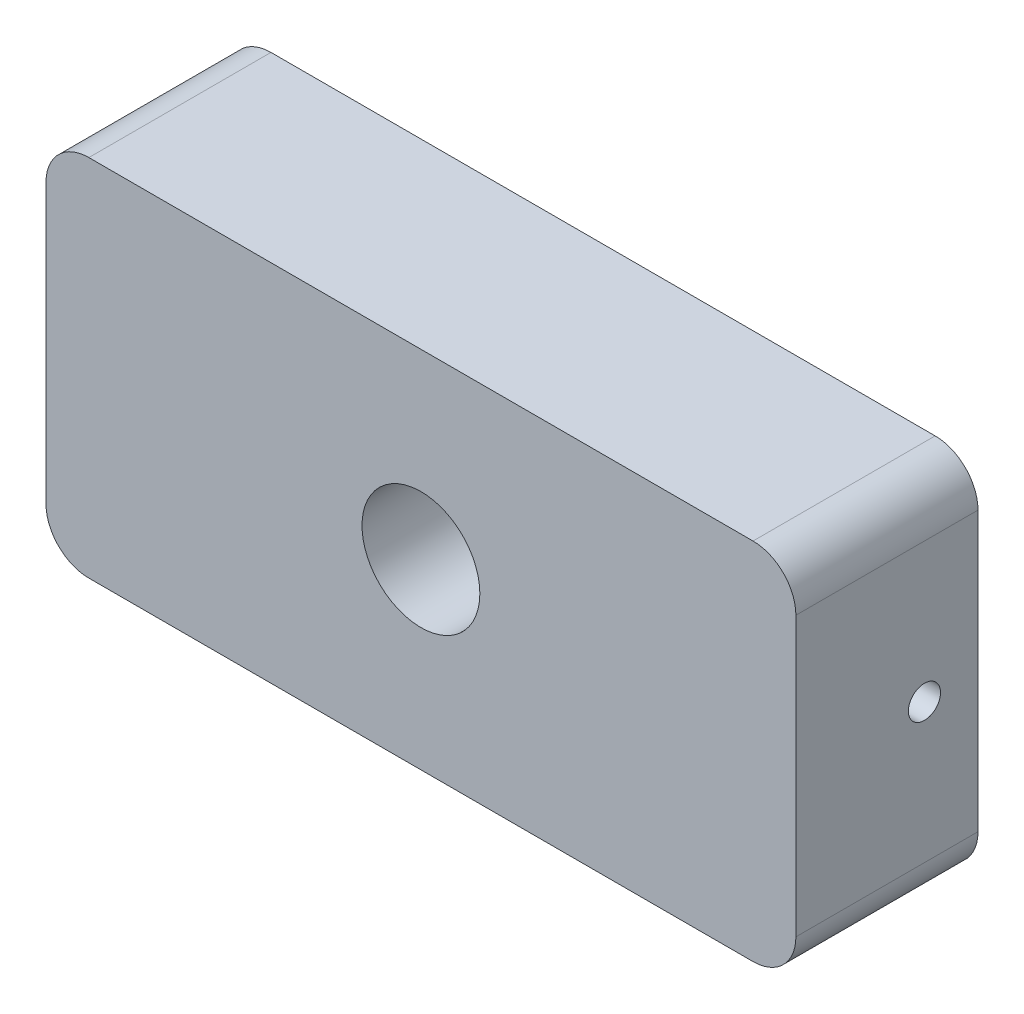
ISO-10303-21;
HEADER;
FILE_DESCRIPTION(('STEP AP214'),'2;1');
FILE_NAME('part.step','',(''),(''),'','','');
FILE_SCHEMA(('AUTOMOTIVE_DESIGN { 1 0 10303 214 1 1 1 1 }'));
ENDSEC;
DATA;
#1=APPLICATION_CONTEXT('core data for automotive mechanical design processes');
#2=APPLICATION_PROTOCOL_DEFINITION('international standard','automotive_design',2000,#1);
#3=PRODUCT_CONTEXT('',#1,'mechanical');
#4=PRODUCT('Part','Part','',(#3));
#5=PRODUCT_RELATED_PRODUCT_CATEGORY('part','',(#4));
#6=PRODUCT_DEFINITION_FORMATION('','',#4);
#7=PRODUCT_DEFINITION_CONTEXT('part definition',#1,'design');
#8=PRODUCT_DEFINITION('design','',#6,#7);
#9=PRODUCT_DEFINITION_SHAPE('','',#8);
#10=(LENGTH_UNIT() NAMED_UNIT(*) SI_UNIT(.MILLI.,.METRE.));
#11=(NAMED_UNIT(*) PLANE_ANGLE_UNIT() SI_UNIT($,.RADIAN.));
#12=(NAMED_UNIT(*) SI_UNIT($,.STERADIAN.) SOLID_ANGLE_UNIT());
#13=UNCERTAINTY_MEASURE_WITH_UNIT(LENGTH_MEASURE(1.E-05),#10,'distance_accuracy_value','');
#14=(GEOMETRIC_REPRESENTATION_CONTEXT(3) GLOBAL_UNCERTAINTY_ASSIGNED_CONTEXT((#13)) GLOBAL_UNIT_ASSIGNED_CONTEXT((#10,
#11,#12)) REPRESENTATION_CONTEXT('',''));
#15=CARTESIAN_POINT('',(0.,0.,0.));
#16=DIRECTION('',(0.,0.,1.));
#17=DIRECTION('',(1.,0.,0.));
#18=AXIS2_PLACEMENT_3D('',#15,#16,#17);
#19=CARTESIAN_POINT('',(0.,0.,0.));
#20=DIRECTION('',(0.,0.,1.));
#21=DIRECTION('',(1.,0.,0.));
#22=AXIS2_PLACEMENT_3D('',#19,#20,#21);
#23=PLANE('',#22);
#24=DIRECTION('',(-1.,0.,0.));
#25=VECTOR('',#24,1.);
#26=CARTESIAN_POINT('',(264.019677402521,55.205269585405,0.));
#27=LINE('',#26,#25);
#28=CARTESIAN_POINT('',(260.019677402521,55.205269585405,0.));
#29=VERTEX_POINT('',#28);
#30=CARTESIAN_POINT('',(198.01967740252,55.205269585405,0.));
#31=VERTEX_POINT('',#30);
#32=EDGE_CURVE('E123',#29,#31,#27,.T.);
#33=ORIENTED_EDGE('',*,*,#32,.F.);
#34=CARTESIAN_POINT('',(260.019677402521,51.205269585405,0.));
#35=DIRECTION('',(0.,0.,1.));
#36=DIRECTION('',(1.,0.,0.));
#37=AXIS2_PLACEMENT_3D('',#34,#35,#36);
#38=CIRCLE('',#37,4.);
#39=CARTESIAN_POINT('',(264.019677402521,51.205269585405,0.));
#40=VERTEX_POINT('',#39);
#41=EDGE_CURVE('E106',#29,#40,#38,.F.);
#42=ORIENTED_EDGE('',*,*,#41,.T.);
#43=DIRECTION('',(0.,1.,0.));
#44=VECTOR('',#43,1.);
#45=CARTESIAN_POINT('',(264.019677402521,21.2052695854051,0.));
#46=LINE('',#45,#44);
#47=CARTESIAN_POINT('',(264.019677402521,25.2052695854051,0.));
#48=VERTEX_POINT('',#47);
#49=EDGE_CURVE('E133',#48,#40,#46,.T.);
#50=ORIENTED_EDGE('',*,*,#49,.F.);
#51=CARTESIAN_POINT('',(260.019677402521,25.2052695854051,0.));
#52=DIRECTION('',(0.,0.,1.));
#53=DIRECTION('',(1.,0.,0.));
#54=AXIS2_PLACEMENT_3D('',#51,#52,#53);
#55=CIRCLE('',#54,4.);
#56=CARTESIAN_POINT('',(260.019677402521,21.2052695854051,0.));
#57=VERTEX_POINT('',#56);
#58=EDGE_CURVE('E117',#48,#57,#55,.F.);
#59=ORIENTED_EDGE('',*,*,#58,.T.);
#60=DIRECTION('',(1.,0.,0.));
#61=VECTOR('',#60,1.);
#62=CARTESIAN_POINT('',(264.019677402521,21.2052695854051,0.));
#63=LINE('',#62,#61);
#64=CARTESIAN_POINT('',(198.01967740252,21.2052695854051,0.));
#65=VERTEX_POINT('',#64);
#66=EDGE_CURVE('E136',#65,#57,#63,.T.);
#67=ORIENTED_EDGE('',*,*,#66,.F.);
#68=CARTESIAN_POINT('',(198.01967740252,25.2052695854051,0.));
#69=DIRECTION('',(0.,0.,1.));
#70=DIRECTION('',(1.,0.,0.));
#71=AXIS2_PLACEMENT_3D('',#68,#69,#70);
#72=CIRCLE('',#71,4.);
#73=CARTESIAN_POINT('',(194.01967740252,25.2052695854051,0.));
#74=VERTEX_POINT('',#73);
#75=EDGE_CURVE('E127',#65,#74,#72,.F.);
#76=ORIENTED_EDGE('',*,*,#75,.T.);
#77=DIRECTION('',(0.,-1.,0.));
#78=VECTOR('',#77,1.);
#79=CARTESIAN_POINT('',(194.01967740252,21.2052695854051,0.));
#80=LINE('',#79,#78);
#81=CARTESIAN_POINT('',(194.01967740252,51.205269585405,0.));
#82=VERTEX_POINT('',#81);
#83=EDGE_CURVE('E163',#82,#74,#80,.T.);
#84=ORIENTED_EDGE('',*,*,#83,.F.);
#85=CARTESIAN_POINT('',(198.01967740252,51.205269585405,0.));
#86=DIRECTION('',(0.,0.,1.));
#87=DIRECTION('',(1.,0.,0.));
#88=AXIS2_PLACEMENT_3D('',#85,#86,#87);
#89=CIRCLE('',#88,4.);
#90=EDGE_CURVE('E132',#82,#31,#89,.F.);
#91=ORIENTED_EDGE('',*,*,#90,.T.);
#92=EDGE_LOOP('',(#33,#42,#50,#59,#67,#76,#84,#91));
#93=FACE_BOUND('',#92,.T.);
#94=CARTESIAN_POINT('',(229.019677402521,38.205269585405,0.));
#95=DIRECTION('',(0.,0.,1.));
#96=DIRECTION('',(1.,0.,0.));
#97=AXIS2_PLACEMENT_3D('',#94,#95,#96);
#98=CIRCLE('',#97,11.2);
#99=CARTESIAN_POINT('',(240.21967740252,38.205269585405,0.));
#100=VERTEX_POINT('',#99);
#101=EDGE_CURVE('E174',#100,#100,#98,.T.);
#102=ORIENTED_EDGE('',*,*,#101,.T.);
#103=EDGE_LOOP('',(#102));
#104=FACE_BOUND('',#103,.T.);
#105=CARTESIAN_POINT('',(201.31967740252,38.205269585405,0.));
#106=DIRECTION('',(0.,0.,1.));
#107=DIRECTION('',(1.,0.,0.));
#108=AXIS2_PLACEMENT_3D('',#105,#106,#107);
#109=CIRCLE('',#108,4.09999999999999);
#110=CARTESIAN_POINT('',(205.41967740252,38.205269585405,0.));
#111=VERTEX_POINT('',#110);
#112=EDGE_CURVE('E179',#111,#111,#109,.T.);
#113=ORIENTED_EDGE('',*,*,#112,.T.);
#114=EDGE_LOOP('',(#113));
#115=FACE_BOUND('',#114,.T.);
#116=CARTESIAN_POINT('',(256.719677402521,38.205269585405,0.));
#117=DIRECTION('',(0.,0.,1.));
#118=DIRECTION('',(-1.,0.,0.));
#119=AXIS2_PLACEMENT_3D('',#116,#117,#118);
#120=CIRCLE('',#119,4.09999999999999);
#121=CARTESIAN_POINT('',(252.61967740252,38.205269585405,0.));
#122=VERTEX_POINT('',#121);
#123=EDGE_CURVE('E187',#122,#122,#120,.T.);
#124=ORIENTED_EDGE('',*,*,#123,.T.);
#125=EDGE_LOOP('',(#124));
#126=FACE_BOUND('',#125,.T.);
#127=ADVANCED_FACE('F39',(#93,#104,#115,#126),#23,.F.);
#128=CARTESIAN_POINT('',(194.01967740252,21.2052695854051,9.));
#129=DIRECTION('',(1.,0.,0.));
#130=DIRECTION('',(0.,0.,-1.));
#131=AXIS2_PLACEMENT_3D('',#128,#129,#130);
#132=PLANE('',#131);
#133=CARTESIAN_POINT('',(194.01967740252,37.9819697808812,5.));
#134=DIRECTION('',(-1.,0.,0.));
#135=DIRECTION('',(0.,0.,1.));
#136=AXIS2_PLACEMENT_3D('',#133,#134,#135);
#137=CIRCLE('',#136,1.5);
#138=CARTESIAN_POINT('',(194.01967740252,37.9819697808812,6.5));
#139=VERTEX_POINT('',#138);
#140=EDGE_CURVE('E202',#139,#139,#137,.T.);
#141=ORIENTED_EDGE('',*,*,#140,.F.);
#142=EDGE_LOOP('',(#141));
#143=FACE_BOUND('',#142,.T.);
#144=DIRECTION('',(0.,-1.,0.));
#145=VECTOR('',#144,1.);
#146=CARTESIAN_POINT('',(194.01967740252,21.2052695854051,17.));
#147=LINE('',#146,#145);
#148=CARTESIAN_POINT('',(194.01967740252,51.205269585405,17.));
#149=VERTEX_POINT('',#148);
#150=CARTESIAN_POINT('',(194.01967740252,25.2052695854051,17.));
#151=VERTEX_POINT('',#150);
#152=EDGE_CURVE('E161',#149,#151,#147,.T.);
#153=ORIENTED_EDGE('',*,*,#152,.F.);
#154=DIRECTION('',(0.,0.,-1.));
#155=VECTOR('',#154,1.);
#156=CARTESIAN_POINT('',(194.01967740252,51.205269585405,9.));
#157=LINE('',#156,#155);
#158=EDGE_CURVE('E11',#149,#82,#157,.T.);
#159=ORIENTED_EDGE('',*,*,#158,.T.);
#160=ORIENTED_EDGE('',*,*,#83,.T.);
#161=DIRECTION('',(0.,0.,-1.));
#162=VECTOR('',#161,1.);
#163=CARTESIAN_POINT('',(194.01967740252,25.2052695854051,9.));
#164=LINE('',#163,#162);
#165=EDGE_CURVE('E47',#74,#151,#164,.F.);
#166=ORIENTED_EDGE('',*,*,#165,.T.);
#167=EDGE_LOOP('',(#153,#159,#160,#166));
#168=FACE_BOUND('',#167,.T.);
#169=ADVANCED_FACE('F160',(#143,#168),#132,.F.);
#170=CARTESIAN_POINT('',(264.019677402521,21.2052695854051,9.));
#171=DIRECTION('',(0.,1.,0.));
#172=DIRECTION('',(0.,0.,1.));
#173=AXIS2_PLACEMENT_3D('',#170,#171,#172);
#174=PLANE('',#173);
#175=ORIENTED_EDGE('',*,*,#66,.T.);
#176=DIRECTION('',(0.,0.,-1.));
#177=VECTOR('',#176,1.);
#178=CARTESIAN_POINT('',(260.019677402521,21.2052695854051,9.));
#179=LINE('',#178,#177);
#180=CARTESIAN_POINT('',(260.019677402521,21.2052695854051,17.));
#181=VERTEX_POINT('',#180);
#182=EDGE_CURVE('E54',#57,#181,#179,.F.);
#183=ORIENTED_EDGE('',*,*,#182,.T.);
#184=DIRECTION('',(1.,0.,0.));
#185=VECTOR('',#184,1.);
#186=CARTESIAN_POINT('',(194.01967740252,21.2052695854051,17.));
#187=LINE('',#186,#185);
#188=CARTESIAN_POINT('',(198.01967740252,21.2052695854051,17.));
#189=VERTEX_POINT('',#188);
#190=EDGE_CURVE('E169',#189,#181,#187,.T.);
#191=ORIENTED_EDGE('',*,*,#190,.F.);
#192=DIRECTION('',(0.,0.,-1.));
#193=VECTOR('',#192,1.);
#194=CARTESIAN_POINT('',(198.01967740252,21.2052695854051,9.));
#195=LINE('',#194,#193);
#196=EDGE_CURVE('E153',#189,#65,#195,.T.);
#197=ORIENTED_EDGE('',*,*,#196,.T.);
#198=EDGE_LOOP('',(#175,#183,#191,#197));
#199=FACE_BOUND('',#198,.T.);
#200=ADVANCED_FACE('F173',(#199),#174,.F.);
#201=CARTESIAN_POINT('',(264.019677402521,21.2052695854051,9.));
#202=DIRECTION('',(-1.,0.,0.));
#203=DIRECTION('',(0.,0.,1.));
#204=AXIS2_PLACEMENT_3D('',#201,#202,#203);
#205=PLANE('',#204);
#206=CARTESIAN_POINT('',(264.019677402521,38.205269585405,5.));
#207=DIRECTION('',(1.,0.,0.));
#208=DIRECTION('',(0.,0.,-1.));
#209=AXIS2_PLACEMENT_3D('',#206,#207,#208);
#210=CIRCLE('',#209,1.5);
#211=CARTESIAN_POINT('',(264.019677402521,38.205269585405,3.5));
#212=VERTEX_POINT('',#211);
#213=EDGE_CURVE('E213',#212,#212,#210,.T.);
#214=ORIENTED_EDGE('',*,*,#213,.F.);
#215=EDGE_LOOP('',(#214));
#216=FACE_BOUND('',#215,.T.);
#217=ORIENTED_EDGE('',*,*,#49,.T.);
#218=DIRECTION('',(0.,0.,-1.));
#219=VECTOR('',#218,1.);
#220=CARTESIAN_POINT('',(264.019677402521,51.205269585405,9.));
#221=LINE('',#220,#219);
#222=CARTESIAN_POINT('',(264.019677402521,51.205269585405,17.));
#223=VERTEX_POINT('',#222);
#224=EDGE_CURVE('E111',#40,#223,#221,.F.);
#225=ORIENTED_EDGE('',*,*,#224,.T.);
#226=DIRECTION('',(0.,1.,0.));
#227=VECTOR('',#226,1.);
#228=CARTESIAN_POINT('',(264.019677402521,21.2052695854051,17.));
#229=LINE('',#228,#227);
#230=CARTESIAN_POINT('',(264.019677402521,25.2052695854051,17.));
#231=VERTEX_POINT('',#230);
#232=EDGE_CURVE('E196',#231,#223,#229,.T.);
#233=ORIENTED_EDGE('',*,*,#232,.F.);
#234=DIRECTION('',(0.,0.,-1.));
#235=VECTOR('',#234,1.);
#236=CARTESIAN_POINT('',(264.019677402521,25.2052695854051,9.));
#237=LINE('',#236,#235);
#238=EDGE_CURVE('E116',#231,#48,#237,.T.);
#239=ORIENTED_EDGE('',*,*,#238,.T.);
#240=EDGE_LOOP('',(#217,#225,#233,#239));
#241=FACE_BOUND('',#240,.T.);
#242=ADVANCED_FACE('F236',(#216,#241),#205,.F.);
#243=CARTESIAN_POINT('',(264.019677402521,55.205269585405,9.));
#244=DIRECTION('',(0.,-1.,0.));
#245=DIRECTION('',(0.,0.,-1.));
#246=AXIS2_PLACEMENT_3D('',#243,#244,#245);
#247=PLANE('',#246);
#248=DIRECTION('',(-1.,0.,0.));
#249=VECTOR('',#248,1.);
#250=CARTESIAN_POINT('',(194.01967740252,55.205269585405,17.));
#251=LINE('',#250,#249);
#252=CARTESIAN_POINT('',(260.019677402521,55.205269585405,17.));
#253=VERTEX_POINT('',#252);
#254=CARTESIAN_POINT('',(198.01967740252,55.205269585405,17.));
#255=VERTEX_POINT('',#254);
#256=EDGE_CURVE('E126',#253,#255,#251,.T.);
#257=ORIENTED_EDGE('',*,*,#256,.F.);
#258=DIRECTION('',(0.,0.,-1.));
#259=VECTOR('',#258,1.);
#260=CARTESIAN_POINT('',(260.019677402521,55.205269585405,9.));
#261=LINE('',#260,#259);
#262=EDGE_CURVE('E110',#253,#29,#261,.T.);
#263=ORIENTED_EDGE('',*,*,#262,.T.);
#264=ORIENTED_EDGE('',*,*,#32,.T.);
#265=DIRECTION('',(0.,0.,-1.));
#266=VECTOR('',#265,1.);
#267=CARTESIAN_POINT('',(198.01967740252,55.205269585405,9.));
#268=LINE('',#267,#266);
#269=EDGE_CURVE('E128',#31,#255,#268,.F.);
#270=ORIENTED_EDGE('',*,*,#269,.T.);
#271=EDGE_LOOP('',(#257,#263,#264,#270));
#272=FACE_BOUND('',#271,.T.);
#273=ADVANCED_FACE('F122',(#272),#247,.F.);
#274=CARTESIAN_POINT('',(229.019677402521,38.205269585405,9.));
#275=DIRECTION('',(0.,0.,-1.));
#276=DIRECTION('',(-1.,0.,0.));
#277=AXIS2_PLACEMENT_3D('',#274,#275,#276);
#278=CYLINDRICAL_SURFACE('',#277,11.2);
#279=CARTESIAN_POINT('',(229.019677402521,38.205269585405,9.));
#280=DIRECTION('',(0.,0.,1.));
#281=DIRECTION('',(1.,0.,0.));
#282=AXIS2_PLACEMENT_3D('',#279,#280,#281);
#283=CIRCLE('',#282,11.2);
#284=CARTESIAN_POINT('',(240.21967740252,38.205269585405,9.));
#285=VERTEX_POINT('',#284);
#286=EDGE_CURVE('E180',#285,#285,#283,.T.);
#287=ORIENTED_EDGE('',*,*,#286,.T.);
#288=EDGE_LOOP('',(#287));
#289=FACE_BOUND('',#288,.T.);
#290=ORIENTED_EDGE('',*,*,#101,.F.);
#291=EDGE_LOOP('',(#290));
#292=FACE_BOUND('',#291,.T.);
#293=ADVANCED_FACE('F262',(#289,#292),#278,.F.);
#294=CARTESIAN_POINT('',(201.31967740252,38.205269585405,9.));
#295=DIRECTION('',(0.,0.,-1.));
#296=DIRECTION('',(-1.,0.,0.));
#297=AXIS2_PLACEMENT_3D('',#294,#295,#296);
#298=CYLINDRICAL_SURFACE('',#297,4.09999999999999);
#299=CARTESIAN_POINT('',(197.225762748146,37.9819697808812,6.5));
#300=CARTESIAN_POINT('',(197.221367614793,38.0625012179052,6.50000328836046));
#301=CARTESIAN_POINT('',(197.219375107897,38.1431426347727,6.49349539894408));
#302=CARTESIAN_POINT('',(197.220053966743,38.3022966627444,6.46761216524692));
#303=CARTESIAN_POINT('',(197.222724138734,38.3808098135071,6.4482401152715));
#304=CARTESIAN_POINT('',(197.2321123036,38.5333752234645,6.39728857691316));
#305=CARTESIAN_POINT('',(197.238824934372,38.6074332492639,6.36572527941889));
#306=CARTESIAN_POINT('',(197.255303751809,38.7493043563949,6.29136215059782));
#307=CARTESIAN_POINT('',(197.265070738513,38.8171157955026,6.24855937574299));
#308=CARTESIAN_POINT('',(197.286722111127,38.9466954188623,6.15153794329933));
#309=CARTESIAN_POINT('',(197.29865849473,39.008238915807,6.09703108520962));
#310=CARTESIAN_POINT('',(197.322963673394,39.1215917853131,5.97876167270551));
#311=CARTESIAN_POINT('',(197.335332573481,39.1733987738196,5.91499685817042));
#312=CARTESIAN_POINT('',(197.359438501729,39.2678036544016,5.77709609144266));
#313=CARTESIAN_POINT('',(197.371132489368,39.3099670455203,5.70265406322479));
#314=CARTESIAN_POINT('',(197.391737894675,39.3811407319749,5.54736734648543));
#315=CARTESIAN_POINT('',(197.400649884609,39.4101537329411,5.46652397903359));
#316=CARTESIAN_POINT('',(197.414255526436,39.4535449676948,5.30250160272966));
#317=CARTESIAN_POINT('',(197.419034976636,39.4682217276506,5.21940900729525));
#318=CARTESIAN_POINT('',(197.423991528752,39.4834323640842,5.05181394508825));
#319=CARTESIAN_POINT('',(197.424169988561,39.483970413323,4.96731190165369));
#320=CARTESIAN_POINT('',(197.419994752806,39.471173345526,4.80310199727771));
#321=CARTESIAN_POINT('',(197.415832545783,39.4584243997324,4.72334259203993));
#322=CARTESIAN_POINT('',(197.403834300367,39.4204097781957,4.56715802309095));
#323=CARTESIAN_POINT('',(197.395997837166,39.3951426551187,4.49073324603671));
#324=CARTESIAN_POINT('',(197.377544472635,39.3325054456182,4.34225511920492));
#325=CARTESIAN_POINT('',(197.366894163897,39.2949885688129,4.27026805337565));
#326=CARTESIAN_POINT('',(197.344186264891,39.2089844826731,4.13341434883987));
#327=CARTESIAN_POINT('',(197.332128288525,39.160494260115,4.06854967318442));
#328=CARTESIAN_POINT('',(197.307503109239,39.0512753360027,3.94467567461708));
#329=CARTESIAN_POINT('',(197.294937757139,38.990089405965,3.88606820640376));
#330=CARTESIAN_POINT('',(197.271503552824,38.8585275447437,3.77983857789863));
#331=CARTESIAN_POINT('',(197.260634735642,38.7881514238383,3.73221664444795));
#332=CARTESIAN_POINT('',(197.242106762837,38.6399946916634,3.6493679632384));
#333=CARTESIAN_POINT('',(197.234449009754,38.5622108629913,3.61414663293722));
#334=CARTESIAN_POINT('',(197.223587133071,38.4015235358884,3.55735371374695));
#335=CARTESIAN_POINT('',(197.220381244493,38.3186220800048,3.53577671730086));
#336=CARTESIAN_POINT('',(197.219210506772,38.1543829795009,3.5077272171885));
#337=CARTESIAN_POINT('',(197.221000655764,38.073162340059,3.50057724967595));
#338=CARTESIAN_POINT('',(197.229452248719,37.9108962759449,3.49949021374117));
#339=CARTESIAN_POINT('',(197.236113139703,37.8298508324301,3.50555164557817));
#340=CARTESIAN_POINT('',(197.253746533803,37.6719905395978,3.53025065056443));
#341=CARTESIAN_POINT('',(197.264624624477,37.5951224245709,3.54861885009072));
#342=CARTESIAN_POINT('',(197.289930708365,37.4457388655082,3.59692384495232));
#343=CARTESIAN_POINT('',(197.304359364383,37.3732242373085,3.62686280085805));
#344=CARTESIAN_POINT('',(197.336386364316,37.2311414678353,3.69889517187315));
#345=CARTESIAN_POINT('',(197.354094960589,37.1618371404738,3.74145902676741));
#346=CARTESIAN_POINT('',(197.390792017068,37.0311859133505,3.83700123033098));
#347=CARTESIAN_POINT('',(197.409781026639,36.9698424626571,3.88998406820988));
#348=CARTESIAN_POINT('',(197.44858602259,36.8529867652243,4.00866634855774));
#349=CARTESIAN_POINT('',(197.468382821481,36.7980492667385,4.07493998842688));
#350=CARTESIAN_POINT('',(197.505616020776,36.7000479791529,4.2163699655763));
#351=CARTESIAN_POINT('',(197.523052381292,36.6569843906962,4.29152645292656));
#352=CARTESIAN_POINT('',(197.553415694641,36.5845258608737,4.44816430220671));
#353=CARTESIAN_POINT('',(197.566383291508,36.5550068657785,4.52957994621173));
#354=CARTESIAN_POINT('',(197.586329802561,36.5103572920452,4.69694694461265));
#355=CARTESIAN_POINT('',(197.593313709825,36.4952147158925,4.78289445369761));
#356=CARTESIAN_POINT('',(197.600005800319,36.4807124477461,4.94908599316728));
#357=CARTESIAN_POINT('',(197.60027589841,36.4801337690108,5.02920262362345));
#358=CARTESIAN_POINT('',(197.594932724905,36.491701049112,5.18830416585669));
#359=CARTESIAN_POINT('',(197.589319975894,36.5038458776896,5.26728917752633));
#360=CARTESIAN_POINT('',(197.573198316194,36.539659445196,5.41905716713205));
#361=CARTESIAN_POINT('',(197.562869837713,36.5629048442061,5.49196072476266));
#362=CARTESIAN_POINT('',(197.538470277004,36.6198898311815,5.63286509426257));
#363=CARTESIAN_POINT('',(197.524398182549,36.653632257836,5.70086457379761));
#364=CARTESIAN_POINT('',(197.492812779153,36.7331791062357,5.83485500562564));
#365=CARTESIAN_POINT('',(197.475134648866,36.7796278433961,5.90042406525771));
#366=CARTESIAN_POINT('',(197.438646067187,36.8821834408752,6.02316773082357));
#367=CARTESIAN_POINT('',(197.419835172341,36.9382940998332,6.0803390186816));
#368=CARTESIAN_POINT('',(197.381305209207,37.0634248525468,6.18896131765127));
#369=CARTESIAN_POINT('',(197.361620749323,37.1330900062561,6.23968502933488));
#370=CARTESIAN_POINT('',(197.324595317932,37.2805555226822,6.32869742117978));
#371=CARTESIAN_POINT('',(197.307254886929,37.3583577543954,6.36698323616553));
#372=CARTESIAN_POINT('',(197.27559136985,37.5248662872464,6.43160192959869));
#373=CARTESIAN_POINT('',(197.261504748902,37.6139444332658,6.45710256073565));
#374=CARTESIAN_POINT('',(197.239132364174,37.7959577592014,6.49129405648455));
#375=CARTESIAN_POINT('',(197.230842710813,37.8888903085011,6.49999619926245));
#376=CARTESIAN_POINT('',(197.225762748146,37.9819697808812,6.5));
#377=B_SPLINE_CURVE_WITH_KNOTS('',3,(#299,#300,#301,#302,#303,#304,#305,#306,#307,#308,#309,
#310,#311,#312,#313,#314,#315,#316,#317,#318,#319,#320,#321,#322,#323,#324,#325,#326,#327,#328,
#329,#330,#331,#332,#333,#334,#335,#336,#337,#338,#339,#340,#341,#342,#343,#344,#345,#346,#347,
#348,#349,#350,#351,#352,#353,#354,#355,#356,#357,#358,#359,#360,#361,#362,#363,#364,#365,#366,
#367,#368,#369,#370,#371,#372,#373,#374,#375,#376),.UNSPECIFIED.,.T.,.F.,(4,2,2,2,2,2,2,2,2,2,2,
2,2,2,2,2,2,2,2,2,2,2,2,2,2,2,2,2,2,2,2,2,2,2,2,2,2,2,4),(0.,0.241619957729488,0.48317806430891,
0.724416460639063,0.965718098470502,1.21383278281615,1.46200814091731,1.71979761110279,
1.97753401822736,2.22978124511476,2.4819540253826,2.72345444358418,2.96498279023832,
3.20951869013188,3.45412181996528,3.70987830394776,3.96564006859273,4.22151342976601,
4.47728531889808,4.72073772489252,4.96416249592787,5.20242599456102,5.44073400488927,
5.68936782963744,5.93810901847851,6.20185073648289,6.46559691087037,6.7268767180445,
6.98793828791348,7.22706929590364,7.46617906313146,7.69682098347663,7.92752533013049,
8.17331118718421,8.41919389790175,8.68311424709649,8.94709534955519,9.22655109578561,
9.50581915572639),.UNSPECIFIED.);
#378=CARTESIAN_POINT('',(197.225762748146,37.9819697808812,6.5));
#379=VERTEX_POINT('',#378);
#380=EDGE_CURVE('E205',#379,#379,#377,.T.);
#381=ORIENTED_EDGE('',*,*,#380,.T.);
#382=EDGE_LOOP('',(#381));
#383=FACE_BOUND('',#382,.T.);
#384=CARTESIAN_POINT('',(201.31967740252,38.205269585405,9.));
#385=DIRECTION('',(0.,0.,1.));
#386=DIRECTION('',(1.,0.,0.));
#387=AXIS2_PLACEMENT_3D('',#384,#385,#386);
#388=CIRCLE('',#387,4.09999999999999);
#389=CARTESIAN_POINT('',(205.41967740252,38.205269585405,9.));
#390=VERTEX_POINT('',#389);
#391=EDGE_CURVE('E183',#390,#390,#388,.T.);
#392=ORIENTED_EDGE('',*,*,#391,.T.);
#393=EDGE_LOOP('',(#392));
#394=FACE_BOUND('',#393,.T.);
#395=ORIENTED_EDGE('',*,*,#112,.F.);
#396=EDGE_LOOP('',(#395));
#397=FACE_BOUND('',#396,.T.);
#398=ADVANCED_FACE('F324',(#383,#394,#397),#298,.F.);
#399=CARTESIAN_POINT('',(256.719677402521,38.205269585405,9.));
#400=DIRECTION('',(0.,0.,-1.));
#401=DIRECTION('',(-1.,0.,0.));
#402=AXIS2_PLACEMENT_3D('',#399,#400,#401);
#403=CYLINDRICAL_SURFACE('',#402,4.09999999999999);
#404=CARTESIAN_POINT('',(260.81967740252,38.205269585405,3.5));
#405=CARTESIAN_POINT('',(260.819679061754,38.2866436840973,3.49999774239284));
#406=CARTESIAN_POINT('',(260.817233434404,38.3680019667986,3.50664266171369));
#407=CARTESIAN_POINT('',(260.807720892994,38.5282948185775,3.53294528247945));
#408=CARTESIAN_POINT('',(260.800654394879,38.6072296051351,3.55260181269478));
#409=CARTESIAN_POINT('',(260.782660791034,38.7603410732945,3.60414464565237));
#410=CARTESIAN_POINT('',(260.771740913055,38.8345263578143,3.63600806156215));
#411=CARTESIAN_POINT('',(260.747134232948,38.9764952528343,3.71094671874485));
#412=CARTESIAN_POINT('',(260.733446728392,39.0442772317444,3.75402480711967));
#413=CARTESIAN_POINT('',(260.704101203919,39.1742754144951,3.85200445435231));
#414=CARTESIAN_POINT('',(260.688389295309,39.2361959902935,3.90728197001066));
#415=CARTESIAN_POINT('',(260.657037869439,39.3501234652035,4.02729309688534));
#416=CARTESIAN_POINT('',(260.641398374051,39.402127538473,4.0920293942555));
#417=CARTESIAN_POINT('',(260.611343512913,39.4965807970649,4.23195663606843));
#418=CARTESIAN_POINT('',(260.596992228645,39.538620058078,4.30743941731413));
#419=CARTESIAN_POINT('',(260.57197283945,39.6092764482369,4.46501228503891));
#420=CARTESIAN_POINT('',(260.561303344357,39.6378986448511,4.54709986321641));
#421=CARTESIAN_POINT('',(260.545429702662,39.6797544345267,4.71215690285583));
#422=CARTESIAN_POINT('',(260.540026718103,39.6935500943969,4.79496408352549));
#423=CARTESIAN_POINT('',(260.534714417968,39.7071187678802,4.96188075448901));
#424=CARTESIAN_POINT('',(260.534802971677,39.7068972201679,5.04598972702406));
#425=CARTESIAN_POINT('',(260.5402916516,39.6928690398242,5.20806364187105));
#426=CARTESIAN_POINT('',(260.545391265127,39.6798309943722,5.28610714531584));
#427=CARTESIAN_POINT('',(260.559829800043,39.6418066799204,5.43881043874728));
#428=CARTESIAN_POINT('',(260.569169328778,39.6168186991282,5.51346974227949));
#429=CARTESIAN_POINT('',(260.591223672069,39.5551638073965,5.65889233907603));
#430=CARTESIAN_POINT('',(260.603997219665,39.5182912101573,5.72955912934113));
#431=CARTESIAN_POINT('',(260.631459633012,39.4340569346625,5.86392985479533));
#432=CARTESIAN_POINT('',(260.646149136369,39.3866917609347,5.92763145903135));
#433=CARTESIAN_POINT('',(260.676930808712,39.2792606822224,6.05053337974803));
#434=CARTESIAN_POINT('',(260.693052711168,39.2185777792476,6.1091881901549));
#435=CARTESIAN_POINT('',(260.724074750718,39.0880477383012,6.21564654931691));
#436=CARTESIAN_POINT('',(260.738974717519,39.0181993265137,6.26344858723549));
#437=CARTESIAN_POINT('',(260.766145376215,38.8699836395572,6.34740761756008));
#438=CARTESIAN_POINT('',(260.778376081048,38.7915102380422,6.38339111572899));
#439=CARTESIAN_POINT('',(260.79853520945,38.6290657932768,6.44146738458586));
#440=CARTESIAN_POINT('',(260.806465447802,38.5450970858186,6.46356601526801));
#441=CARTESIAN_POINT('',(260.816815289096,38.3786429102147,6.49221548147773));
#442=CARTESIAN_POINT('',(260.819495191372,38.2963000240324,6.49950144656874));
#443=CARTESIAN_POINT('',(260.819841373979,38.1315345965993,6.50044869781518));
#444=CARTESIAN_POINT('',(260.817508702873,38.0491120756122,6.49411283347612));
#445=CARTESIAN_POINT('',(260.808263773197,37.8896499033289,6.4685607588009));
#446=CARTESIAN_POINT('',(260.801520362706,37.8125234031727,6.44981914837904));
#447=CARTESIAN_POINT('',(260.784301108989,37.6625582052641,6.40060523225225));
#448=CARTESIAN_POINT('',(260.773824780177,37.589720066786,6.3701314003584));
#449=CARTESIAN_POINT('',(260.74980554702,37.4480504855193,6.29736021448218));
#450=CARTESIAN_POINT('',(260.736182986941,37.379394943167,6.25474750546132));
#451=CARTESIAN_POINT('',(260.707387497237,37.2499841092975,6.1592675392469));
#452=CARTESIAN_POINT('',(260.692214016435,37.1892316439885,6.1063966303809));
#453=CARTESIAN_POINT('',(260.660953807017,37.0738499266052,5.98846500373468));
#454=CARTESIAN_POINT('',(260.644862873023,37.0197433142404,5.92289274450286));
#455=CARTESIAN_POINT('',(260.614402830142,36.9232072468924,5.78327443760704));
#456=CARTESIAN_POINT('',(260.600033837664,36.8807785811262,5.70922781770882));
#457=CARTESIAN_POINT('',(260.574727466041,36.8088257593965,5.55430440365743));
#458=CARTESIAN_POINT('',(260.56379869737,36.7793339113663,5.47341110450752));
#459=CARTESIAN_POINT('',(260.546899413018,36.7345706814777,5.30729891362738));
#460=CARTESIAN_POINT('',(260.540926029685,36.7192910744547,5.22208255397064));
#461=CARTESIAN_POINT('',(260.534982693811,36.704101495715,5.05537531054673));
#462=CARTESIAN_POINT('',(260.534666813532,36.7033058505211,4.97397673583938));
#463=CARTESIAN_POINT('',(260.539194507507,36.7148579666074,4.81227167250528));
#464=CARTESIAN_POINT('',(260.544037639632,36.7272046015932,4.73196509089193));
#465=CARTESIAN_POINT('',(260.55805624476,36.7640143441619,4.57696752624474));
#466=CARTESIAN_POINT('',(260.567108296901,36.7881331896699,4.50218268625948));
#467=CARTESIAN_POINT('',(260.588458536866,36.8475056354945,4.35767343090592));
#468=CARTESIAN_POINT('',(260.600757525574,36.8827619833844,4.28795026945694));
#469=CARTESIAN_POINT('',(260.627989728743,36.9654795255712,4.15171446310321));
#470=CARTESIAN_POINT('',(260.643024674357,37.0134675759939,4.08554226381096));
#471=CARTESIAN_POINT('',(260.673668401725,37.119454032187,3.96190601069377));
#472=CARTESIAN_POINT('',(260.689277360127,37.1774555401584,3.90444466591117));
#473=CARTESIAN_POINT('',(260.720257095431,37.3053269050552,3.79690996493429));
#474=CARTESIAN_POINT('',(260.735576048715,37.3756481578456,3.74735616085239));
#475=CARTESIAN_POINT('',(260.763410983268,37.5241533234383,3.66079669212791));
#476=CARTESIAN_POINT('',(260.775926972696,37.6023372133516,3.62379099095774));
#477=CARTESIAN_POINT('',(260.796965846716,37.7662987009516,3.56294732250896));
#478=CARTESIAN_POINT('',(260.805390236458,37.8522096230516,3.53943189483783));
#479=CARTESIAN_POINT('',(260.816743894051,38.02717747425,3.50796290264725));
#480=CARTESIAN_POINT('',(260.819675587047,38.1162329972346,3.50000247019189));
#481=CARTESIAN_POINT('',(260.81967740252,38.205269585405,3.5));
#482=B_SPLINE_CURVE_WITH_KNOTS('',3,(#404,#405,#406,#407,#408,#409,#410,#411,#412,#413,#414,
#415,#416,#417,#418,#419,#420,#421,#422,#423,#424,#425,#426,#427,#428,#429,#430,#431,#432,#433,
#434,#435,#436,#437,#438,#439,#440,#441,#442,#443,#444,#445,#446,#447,#448,#449,#450,#451,#452,
#453,#454,#455,#456,#457,#458,#459,#460,#461,#462,#463,#464,#465,#466,#467,#468,#469,#470,#471,
#472,#473,#474,#475,#476,#477,#478,#479,#480,#481),.UNSPECIFIED.,.T.,.F.,(4,2,2,2,2,2,2,2,2,2,2,
2,2,2,2,2,2,2,2,2,2,2,2,2,2,2,2,2,2,2,2,2,2,2,2,2,2,2,4),(0.,0.243794049083331,
0.487566156226916,0.730883431502577,0.974262538792064,1.22657525763995,1.47895976933048,
1.74040261461263,2.00174663626735,2.25278996657886,2.50373589271098,2.74049742501652,
2.97729288286409,3.21842895973516,3.45964548923986,3.71623310666607,3.97285642230447,
4.23309408884832,4.49322185031937,4.74008954228773,4.98690559784361,5.22478638264146,
5.46269812268128,5.70746441042718,5.95231798947644,6.21067838421004,6.46905623512597,
6.72807572592057,6.98694521883869,7.22992815591335,7.47289027100512,7.70913823600103,
7.94544452791356,8.19369587790558,8.44202427542416,8.70289171135231,8.96375838788767,
9.23062685247367,9.49737746102694),.UNSPECIFIED.);
#483=CARTESIAN_POINT('',(260.81967740252,38.205269585405,3.5));
#484=VERTEX_POINT('',#483);
#485=EDGE_CURVE('E227',#484,#484,#482,.T.);
#486=ORIENTED_EDGE('',*,*,#485,.T.);
#487=EDGE_LOOP('',(#486));
#488=FACE_BOUND('',#487,.T.);
#489=CARTESIAN_POINT('',(256.719677402521,38.205269585405,9.));
#490=DIRECTION('',(0.,0.,1.));
#491=DIRECTION('',(-1.,0.,0.));
#492=AXIS2_PLACEMENT_3D('',#489,#490,#491);
#493=CIRCLE('',#492,4.09999999999999);
#494=CARTESIAN_POINT('',(252.61967740252,38.205269585405,9.));
#495=VERTEX_POINT('',#494);
#496=EDGE_CURVE('E184',#495,#495,#493,.T.);
#497=ORIENTED_EDGE('',*,*,#496,.T.);
#498=EDGE_LOOP('',(#497));
#499=FACE_BOUND('',#498,.T.);
#500=ORIENTED_EDGE('',*,*,#123,.F.);
#501=EDGE_LOOP('',(#500));
#502=FACE_BOUND('',#501,.T.);
#503=ADVANCED_FACE('F318',(#488,#499,#502),#403,.F.);
#504=CARTESIAN_POINT('',(0.,0.,9.));
#505=DIRECTION('',(0.,0.,-1.));
#506=DIRECTION('',(-1.,0.,0.));
#507=AXIS2_PLACEMENT_3D('',#504,#505,#506);
#508=PLANE('',#507);
#509=ORIENTED_EDGE('',*,*,#496,.F.);
#510=EDGE_LOOP('',(#509));
#511=FACE_BOUND('',#510,.T.);
#512=ADVANCED_FACE('F323',(#511),#508,.T.);
#513=CARTESIAN_POINT('',(229.019677402521,38.2052695854051,17.));
#514=DIRECTION('',(0.,0.,-1.));
#515=DIRECTION('',(-1.,0.,0.));
#516=AXIS2_PLACEMENT_3D('',#513,#514,#515);
#517=CYLINDRICAL_SURFACE('',#516,5.50000000000002);
#518=CARTESIAN_POINT('',(229.019677402521,38.2052695854051,17.));
#519=DIRECTION('',(0.,0.,1.));
#520=DIRECTION('',(1.,0.,0.));
#521=AXIS2_PLACEMENT_3D('',#518,#519,#520);
#522=CIRCLE('',#521,5.50000000000002);
#523=CARTESIAN_POINT('',(234.519677402521,38.2052695854051,17.));
#524=VERTEX_POINT('',#523);
#525=EDGE_CURVE('E198',#524,#524,#522,.T.);
#526=ORIENTED_EDGE('',*,*,#525,.T.);
#527=EDGE_LOOP('',(#526));
#528=FACE_BOUND('',#527,.T.);
#529=CARTESIAN_POINT('',(229.019677402521,38.2052695854051,9.));
#530=DIRECTION('',(0.,0.,1.));
#531=DIRECTION('',(1.,0.,0.));
#532=AXIS2_PLACEMENT_3D('',#529,#530,#531);
#533=CIRCLE('',#532,5.50000000000002);
#534=CARTESIAN_POINT('',(234.519677402521,38.2052695854051,9.));
#535=VERTEX_POINT('',#534);
#536=EDGE_CURVE('E199',#535,#535,#533,.T.);
#537=ORIENTED_EDGE('',*,*,#536,.F.);
#538=EDGE_LOOP('',(#537));
#539=FACE_BOUND('',#538,.T.);
#540=ADVANCED_FACE('F288',(#528,#539),#517,.F.);
#541=CARTESIAN_POINT('',(0.,0.,17.));
#542=DIRECTION('',(0.,0.,-1.));
#543=DIRECTION('',(-1.,0.,0.));
#544=AXIS2_PLACEMENT_3D('',#541,#542,#543);
#545=PLANE('',#544);
#546=ORIENTED_EDGE('',*,*,#232,.T.);
#547=CARTESIAN_POINT('',(260.019677402521,51.205269585405,17.));
#548=DIRECTION('',(0.,0.,-1.));
#549=DIRECTION('',(-1.,0.,0.));
#550=AXIS2_PLACEMENT_3D('',#547,#548,#549);
#551=CIRCLE('',#550,4.);
#552=EDGE_CURVE('E151',#223,#253,#551,.F.);
#553=ORIENTED_EDGE('',*,*,#552,.T.);
#554=ORIENTED_EDGE('',*,*,#256,.T.);
#555=CARTESIAN_POINT('',(198.01967740252,51.205269585405,17.));
#556=DIRECTION('',(0.,0.,-1.));
#557=DIRECTION('',(-1.,0.,0.));
#558=AXIS2_PLACEMENT_3D('',#555,#556,#557);
#559=CIRCLE('',#558,4.);
#560=EDGE_CURVE('E147',#255,#149,#559,.F.);
#561=ORIENTED_EDGE('',*,*,#560,.T.);
#562=ORIENTED_EDGE('',*,*,#152,.T.);
#563=CARTESIAN_POINT('',(198.01967740252,25.2052695854051,17.));
#564=DIRECTION('',(0.,0.,-1.));
#565=DIRECTION('',(-1.,0.,0.));
#566=AXIS2_PLACEMENT_3D('',#563,#564,#565);
#567=CIRCLE('',#566,4.);
#568=EDGE_CURVE('E61',#151,#189,#567,.F.);
#569=ORIENTED_EDGE('',*,*,#568,.T.);
#570=ORIENTED_EDGE('',*,*,#190,.T.);
#571=CARTESIAN_POINT('',(260.019677402521,25.2052695854051,17.));
#572=DIRECTION('',(0.,0.,-1.));
#573=DIRECTION('',(-1.,0.,0.));
#574=AXIS2_PLACEMENT_3D('',#571,#572,#573);
#575=CIRCLE('',#574,4.);
#576=EDGE_CURVE('E149',#181,#231,#575,.F.);
#577=ORIENTED_EDGE('',*,*,#576,.T.);
#578=EDGE_LOOP('',(#546,#553,#554,#561,#562,#569,#570,#577));
#579=FACE_BOUND('',#578,.T.);
#580=ORIENTED_EDGE('',*,*,#525,.F.);
#581=EDGE_LOOP('',(#580));
#582=FACE_BOUND('',#581,.T.);
#583=ADVANCED_FACE('F166',(#579,#582),#545,.F.);
#584=ORIENTED_EDGE('',*,*,#536,.T.);
#585=EDGE_LOOP('',(#584));
#586=FACE_BOUND('',#585,.T.);
#587=ORIENTED_EDGE('',*,*,#286,.F.);
#588=EDGE_LOOP('',(#587));
#589=FACE_BOUND('',#588,.T.);
#590=ADVANCED_FACE('F287',(#586,#589),#508,.T.);
#591=ORIENTED_EDGE('',*,*,#391,.F.);
#592=EDGE_LOOP('',(#591));
#593=FACE_BOUND('',#592,.T.);
#594=ADVANCED_FACE('F352',(#593),#508,.T.);
#595=CARTESIAN_POINT('',(264.020677402521,37.9819697808812,5.));
#596=DIRECTION('',(-1.,0.,0.));
#597=DIRECTION('',(0.,0.,1.));
#598=AXIS2_PLACEMENT_3D('',#595,#596,#597);
#599=CYLINDRICAL_SURFACE('',#598,1.5);
#600=ORIENTED_EDGE('',*,*,#380,.F.);
#601=EDGE_LOOP('',(#600));
#602=FACE_BOUND('',#601,.T.);
#603=ORIENTED_EDGE('',*,*,#140,.T.);
#604=EDGE_LOOP('',(#603));
#605=FACE_BOUND('',#604,.T.);
#606=ADVANCED_FACE('F215',(#602,#605),#599,.F.);
#607=CARTESIAN_POINT('',(194.01867740252,38.205269585405,5.));
#608=DIRECTION('',(1.,0.,0.));
#609=DIRECTION('',(0.,0.,-1.));
#610=AXIS2_PLACEMENT_3D('',#607,#608,#609);
#611=CYLINDRICAL_SURFACE('',#610,1.5);
#612=ORIENTED_EDGE('',*,*,#485,.F.);
#613=EDGE_LOOP('',(#612));
#614=FACE_BOUND('',#613,.T.);
#615=ORIENTED_EDGE('',*,*,#213,.T.);
#616=EDGE_LOOP('',(#615));
#617=FACE_BOUND('',#616,.T.);
#618=ADVANCED_FACE('F220',(#614,#617),#611,.F.);
#619=CARTESIAN_POINT('',(260.019677402521,51.205269585405,9.));
#620=DIRECTION('',(0.,0.,-1.));
#621=DIRECTION('',(-1.,0.,0.));
#622=AXIS2_PLACEMENT_3D('',#619,#620,#621);
#623=CYLINDRICAL_SURFACE('',#622,4.);
#624=ORIENTED_EDGE('',*,*,#552,.F.);
#625=ORIENTED_EDGE('',*,*,#224,.F.);
#626=ORIENTED_EDGE('',*,*,#41,.F.);
#627=ORIENTED_EDGE('',*,*,#262,.F.);
#628=EDGE_LOOP('',(#624,#625,#626,#627));
#629=FACE_BOUND('',#628,.T.);
#630=ADVANCED_FACE('F109',(#629),#623,.T.);
#631=CARTESIAN_POINT('',(260.019677402521,25.2052695854051,9.));
#632=DIRECTION('',(0.,0.,-1.));
#633=DIRECTION('',(-1.,0.,0.));
#634=AXIS2_PLACEMENT_3D('',#631,#632,#633);
#635=CYLINDRICAL_SURFACE('',#634,4.);
#636=ORIENTED_EDGE('',*,*,#576,.F.);
#637=ORIENTED_EDGE('',*,*,#182,.F.);
#638=ORIENTED_EDGE('',*,*,#58,.F.);
#639=ORIENTED_EDGE('',*,*,#238,.F.);
#640=EDGE_LOOP('',(#636,#637,#638,#639));
#641=FACE_BOUND('',#640,.T.);
#642=ADVANCED_FACE('F244',(#641),#635,.T.);
#643=CARTESIAN_POINT('',(198.01967740252,51.205269585405,9.));
#644=DIRECTION('',(0.,0.,-1.));
#645=DIRECTION('',(-1.,0.,0.));
#646=AXIS2_PLACEMENT_3D('',#643,#644,#645);
#647=CYLINDRICAL_SURFACE('',#646,4.);
#648=ORIENTED_EDGE('',*,*,#560,.F.);
#649=ORIENTED_EDGE('',*,*,#269,.F.);
#650=ORIENTED_EDGE('',*,*,#90,.F.);
#651=ORIENTED_EDGE('',*,*,#158,.F.);
#652=EDGE_LOOP('',(#648,#649,#650,#651));
#653=FACE_BOUND('',#652,.T.);
#654=ADVANCED_FACE('F246',(#653),#647,.T.);
#655=CARTESIAN_POINT('',(198.01967740252,25.2052695854051,9.));
#656=DIRECTION('',(0.,0.,-1.));
#657=DIRECTION('',(-1.,0.,0.));
#658=AXIS2_PLACEMENT_3D('',#655,#656,#657);
#659=CYLINDRICAL_SURFACE('',#658,4.);
#660=ORIENTED_EDGE('',*,*,#568,.F.);
#661=ORIENTED_EDGE('',*,*,#165,.F.);
#662=ORIENTED_EDGE('',*,*,#75,.F.);
#663=ORIENTED_EDGE('',*,*,#196,.F.);
#664=EDGE_LOOP('',(#660,#661,#662,#663));
#665=FACE_BOUND('',#664,.T.);
#666=ADVANCED_FACE('F41',(#665),#659,.T.);
#667=CLOSED_SHELL('',(#127,#169,#200,#242,#273,#293,#398,#503,#512,#540,#583,#590,#594,#606,
#618,#630,#642,#654,#666));
#668=MANIFOLD_SOLID_BREP('B2',#667);
#669=ADVANCED_BREP_SHAPE_REPRESENTATION('',(#18,#668),#14);
#670=SHAPE_DEFINITION_REPRESENTATION(#9,#669);
ENDSEC;
END-ISO-10303-21;
